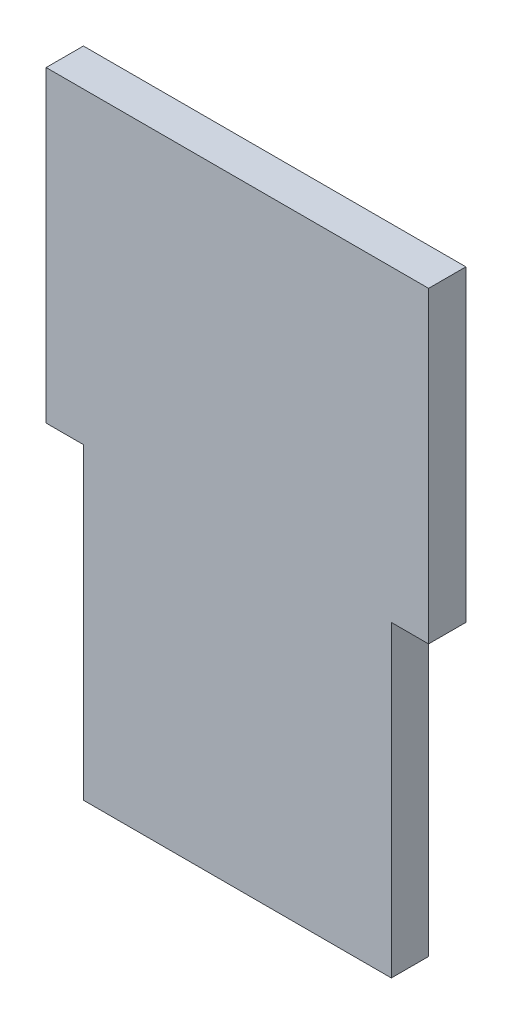
ISO-10303-21;
HEADER;
FILE_DESCRIPTION(('STEP AP214'),'2;1');
FILE_NAME('part.step','',(''),(''),'','','');
FILE_SCHEMA(('AUTOMOTIVE_DESIGN { 1 0 10303 214 1 1 1 1 }'));
ENDSEC;
DATA;
#1=APPLICATION_CONTEXT('core data for automotive mechanical design processes');
#2=APPLICATION_PROTOCOL_DEFINITION('international standard','automotive_design',2000,#1);
#3=PRODUCT_CONTEXT('',#1,'mechanical');
#4=PRODUCT('Part','Part','',(#3));
#5=PRODUCT_RELATED_PRODUCT_CATEGORY('part','',(#4));
#6=PRODUCT_DEFINITION_FORMATION('','',#4);
#7=PRODUCT_DEFINITION_CONTEXT('part definition',#1,'design');
#8=PRODUCT_DEFINITION('design','',#6,#7);
#9=PRODUCT_DEFINITION_SHAPE('','',#8);
#10=(LENGTH_UNIT() NAMED_UNIT(*) SI_UNIT(.MILLI.,.METRE.));
#11=(NAMED_UNIT(*) PLANE_ANGLE_UNIT() SI_UNIT($,.RADIAN.));
#12=(NAMED_UNIT(*) SI_UNIT($,.STERADIAN.) SOLID_ANGLE_UNIT());
#13=UNCERTAINTY_MEASURE_WITH_UNIT(LENGTH_MEASURE(1.E-05),#10,'distance_accuracy_value','');
#14=(GEOMETRIC_REPRESENTATION_CONTEXT(3) GLOBAL_UNCERTAINTY_ASSIGNED_CONTEXT((#13)) GLOBAL_UNIT_ASSIGNED_CONTEXT((#10,
#11,#12)) REPRESENTATION_CONTEXT('',''));
#15=CARTESIAN_POINT('',(0.,0.,0.));
#16=DIRECTION('',(0.,0.,1.));
#17=DIRECTION('',(1.,0.,0.));
#18=AXIS2_PLACEMENT_3D('',#15,#16,#17);
#19=CARTESIAN_POINT('',(-3.07339999999999,0.,3.0734));
#20=DIRECTION('',(1.,0.,0.));
#21=DIRECTION('',(0.,1.,0.));
#22=AXIS2_PLACEMENT_3D('',#19,#20,#21);
#23=PLANE('',#22);
#24=DIRECTION('',(0.,-1.,0.));
#25=VECTOR('',#24,1.);
#26=CARTESIAN_POINT('',(-3.07339999999999,0.,0.));
#27=LINE('',#26,#25);
#28=CARTESIAN_POINT('',(-3.0734,50.8,0.));
#29=VERTEX_POINT('',#28);
#30=CARTESIAN_POINT('',(-3.0734,25.4,0.));
#31=VERTEX_POINT('',#30);
#32=EDGE_CURVE('E127',#29,#31,#27,.T.);
#33=ORIENTED_EDGE('',*,*,#32,.T.);
#34=DIRECTION('',(0.,0.,-1.));
#35=VECTOR('',#34,1.);
#36=CARTESIAN_POINT('',(-3.0734,25.4,3.0734));
#37=LINE('',#36,#35);
#38=CARTESIAN_POINT('',(-3.0734,25.4,3.0734));
#39=VERTEX_POINT('',#38);
#40=EDGE_CURVE('E11',#39,#31,#37,.T.);
#41=ORIENTED_EDGE('',*,*,#40,.F.);
#42=DIRECTION('',(0.,-1.,0.));
#43=VECTOR('',#42,1.);
#44=CARTESIAN_POINT('',(-3.07339999999999,0.,3.0734));
#45=LINE('',#44,#43);
#46=CARTESIAN_POINT('',(-3.0734,50.8,3.0734));
#47=VERTEX_POINT('',#46);
#48=EDGE_CURVE('E145',#47,#39,#45,.T.);
#49=ORIENTED_EDGE('',*,*,#48,.F.);
#50=DIRECTION('',(0.,0.,-1.));
#51=VECTOR('',#50,1.);
#52=CARTESIAN_POINT('',(-3.0734,50.8,3.0734));
#53=LINE('',#52,#51);
#54=EDGE_CURVE('E123',#47,#29,#53,.T.);
#55=ORIENTED_EDGE('',*,*,#54,.T.);
#56=EDGE_LOOP('',(#33,#41,#49,#55));
#57=FACE_BOUND('',#56,.T.);
#58=ADVANCED_FACE('F33',(#57),#23,.F.);
#59=CARTESIAN_POINT('',(0.,25.4,3.0734));
#60=DIRECTION('',(0.,1.,0.));
#61=DIRECTION('',(0.,0.,1.));
#62=AXIS2_PLACEMENT_3D('',#59,#60,#61);
#63=PLANE('',#62);
#64=DIRECTION('',(1.,0.,0.));
#65=VECTOR('',#64,1.);
#66=CARTESIAN_POINT('',(0.,25.4,0.));
#67=LINE('',#66,#65);
#68=CARTESIAN_POINT('',(0.,25.4,0.));
#69=VERTEX_POINT('',#68);
#70=EDGE_CURVE('E130',#31,#69,#67,.T.);
#71=ORIENTED_EDGE('',*,*,#70,.T.);
#72=DIRECTION('',(0.,0.,-1.));
#73=VECTOR('',#72,1.);
#74=CARTESIAN_POINT('',(0.,25.4,3.0734));
#75=LINE('',#74,#73);
#76=CARTESIAN_POINT('',(0.,25.4,3.0734));
#77=VERTEX_POINT('',#76);
#78=EDGE_CURVE('E41',#77,#69,#75,.T.);
#79=ORIENTED_EDGE('',*,*,#78,.F.);
#80=DIRECTION('',(1.,0.,0.));
#81=VECTOR('',#80,1.);
#82=CARTESIAN_POINT('',(0.,25.4,3.0734));
#83=LINE('',#82,#81);
#84=EDGE_CURVE('E88',#39,#77,#83,.T.);
#85=ORIENTED_EDGE('',*,*,#84,.F.);
#86=ORIENTED_EDGE('',*,*,#40,.T.);
#87=EDGE_LOOP('',(#71,#79,#85,#86));
#88=FACE_BOUND('',#87,.T.);
#89=ADVANCED_FACE('F159',(#88),#63,.F.);
#90=CARTESIAN_POINT('',(0.,0.,3.0734));
#91=DIRECTION('',(-1.,0.,0.));
#92=DIRECTION('',(0.,0.,1.));
#93=AXIS2_PLACEMENT_3D('',#90,#91,#92);
#94=PLANE('',#93);
#95=DIRECTION('',(0.,1.,0.));
#96=VECTOR('',#95,1.);
#97=CARTESIAN_POINT('',(0.,0.,0.));
#98=LINE('',#97,#96);
#99=CARTESIAN_POINT('',(0.,0.,0.));
#100=VERTEX_POINT('',#99);
#101=EDGE_CURVE('E133',#100,#69,#98,.T.);
#102=ORIENTED_EDGE('',*,*,#101,.F.);
#103=DIRECTION('',(0.,0.,-1.));
#104=VECTOR('',#103,1.);
#105=CARTESIAN_POINT('',(0.,0.,3.0734));
#106=LINE('',#105,#104);
#107=CARTESIAN_POINT('',(0.,0.,3.0734));
#108=VERTEX_POINT('',#107);
#109=EDGE_CURVE('E152',#108,#100,#106,.T.);
#110=ORIENTED_EDGE('',*,*,#109,.F.);
#111=DIRECTION('',(0.,1.,0.));
#112=VECTOR('',#111,1.);
#113=CARTESIAN_POINT('',(0.,0.,3.0734));
#114=LINE('',#113,#112);
#115=EDGE_CURVE('E158',#108,#77,#114,.T.);
#116=ORIENTED_EDGE('',*,*,#115,.T.);
#117=ORIENTED_EDGE('',*,*,#78,.T.);
#118=EDGE_LOOP('',(#102,#110,#116,#117));
#119=FACE_BOUND('',#118,.T.);
#120=ADVANCED_FACE('F156',(#119),#94,.T.);
#121=CARTESIAN_POINT('',(0.,0.,3.0734));
#122=DIRECTION('',(0.,1.,0.));
#123=DIRECTION('',(0.,0.,1.));
#124=AXIS2_PLACEMENT_3D('',#121,#122,#123);
#125=PLANE('',#124);
#126=DIRECTION('',(1.,0.,0.));
#127=VECTOR('',#126,1.);
#128=CARTESIAN_POINT('',(0.,0.,0.));
#129=LINE('',#128,#127);
#130=CARTESIAN_POINT('',(25.4,0.,0.));
#131=VERTEX_POINT('',#130);
#132=EDGE_CURVE('E136',#100,#131,#129,.T.);
#133=ORIENTED_EDGE('',*,*,#132,.T.);
#134=DIRECTION('',(0.,0.,-1.));
#135=VECTOR('',#134,1.);
#136=CARTESIAN_POINT('',(25.4,0.,3.0734));
#137=LINE('',#136,#135);
#138=CARTESIAN_POINT('',(25.4,0.,3.0734));
#139=VERTEX_POINT('',#138);
#140=EDGE_CURVE('E149',#139,#131,#137,.T.);
#141=ORIENTED_EDGE('',*,*,#140,.F.);
#142=DIRECTION('',(1.,0.,0.));
#143=VECTOR('',#142,1.);
#144=CARTESIAN_POINT('',(0.,0.,3.0734));
#145=LINE('',#144,#143);
#146=EDGE_CURVE('E172',#108,#139,#145,.T.);
#147=ORIENTED_EDGE('',*,*,#146,.F.);
#148=ORIENTED_EDGE('',*,*,#109,.T.);
#149=EDGE_LOOP('',(#133,#141,#147,#148));
#150=FACE_BOUND('',#149,.T.);
#151=ADVANCED_FACE('F168',(#150),#125,.F.);
#152=CARTESIAN_POINT('',(25.4,0.,3.0734));
#153=DIRECTION('',(-1.,0.,0.));
#154=DIRECTION('',(0.,-1.,0.));
#155=AXIS2_PLACEMENT_3D('',#152,#153,#154);
#156=PLANE('',#155);
#157=DIRECTION('',(0.,1.,0.));
#158=VECTOR('',#157,1.);
#159=CARTESIAN_POINT('',(25.4,0.,0.));
#160=LINE('',#159,#158);
#161=CARTESIAN_POINT('',(25.4,25.4,0.));
#162=VERTEX_POINT('',#161);
#163=EDGE_CURVE('E138',#131,#162,#160,.T.);
#164=ORIENTED_EDGE('',*,*,#163,.T.);
#165=DIRECTION('',(0.,0.,-1.));
#166=VECTOR('',#165,1.);
#167=CARTESIAN_POINT('',(25.4,25.4,3.0734));
#168=LINE('',#167,#166);
#169=CARTESIAN_POINT('',(25.4,25.4,3.0734));
#170=VERTEX_POINT('',#169);
#171=EDGE_CURVE('E113',#170,#162,#168,.T.);
#172=ORIENTED_EDGE('',*,*,#171,.F.);
#173=DIRECTION('',(0.,1.,0.));
#174=VECTOR('',#173,1.);
#175=CARTESIAN_POINT('',(25.4,0.,3.0734));
#176=LINE('',#175,#174);
#177=EDGE_CURVE('E118',#139,#170,#176,.T.);
#178=ORIENTED_EDGE('',*,*,#177,.F.);
#179=ORIENTED_EDGE('',*,*,#140,.T.);
#180=EDGE_LOOP('',(#164,#172,#178,#179));
#181=FACE_BOUND('',#180,.T.);
#182=ADVANCED_FACE('F171',(#181),#156,.F.);
#183=CARTESIAN_POINT('',(0.,25.4,3.0734));
#184=DIRECTION('',(0.,-1.,0.));
#185=DIRECTION('',(0.,0.,-1.));
#186=AXIS2_PLACEMENT_3D('',#183,#184,#185);
#187=PLANE('',#186);
#188=DIRECTION('',(-1.,0.,0.));
#189=VECTOR('',#188,1.);
#190=CARTESIAN_POINT('',(0.,25.4,0.));
#191=LINE('',#190,#189);
#192=CARTESIAN_POINT('',(28.4734,25.4,0.));
#193=VERTEX_POINT('',#192);
#194=EDGE_CURVE('E108',#193,#162,#191,.T.);
#195=ORIENTED_EDGE('',*,*,#194,.F.);
#196=DIRECTION('',(0.,0.,-1.));
#197=VECTOR('',#196,1.);
#198=CARTESIAN_POINT('',(28.4734,25.4,3.0734));
#199=LINE('',#198,#197);
#200=CARTESIAN_POINT('',(28.4734,25.4,3.0734));
#201=VERTEX_POINT('',#200);
#202=EDGE_CURVE('E103',#201,#193,#199,.T.);
#203=ORIENTED_EDGE('',*,*,#202,.F.);
#204=DIRECTION('',(-1.,0.,0.));
#205=VECTOR('',#204,1.);
#206=CARTESIAN_POINT('',(0.,25.4,3.0734));
#207=LINE('',#206,#205);
#208=EDGE_CURVE('E106',#201,#170,#207,.T.);
#209=ORIENTED_EDGE('',*,*,#208,.T.);
#210=ORIENTED_EDGE('',*,*,#171,.T.);
#211=EDGE_LOOP('',(#195,#203,#209,#210));
#212=FACE_BOUND('',#211,.T.);
#213=ADVANCED_FACE('F105',(#212),#187,.T.);
#214=CARTESIAN_POINT('',(28.4734,0.,3.0734));
#215=DIRECTION('',(1.,0.,0.));
#216=DIRECTION('',(0.,1.,0.));
#217=AXIS2_PLACEMENT_3D('',#214,#215,#216);
#218=PLANE('',#217);
#219=DIRECTION('',(0.,-1.,0.));
#220=VECTOR('',#219,1.);
#221=CARTESIAN_POINT('',(28.4734,0.,0.));
#222=LINE('',#221,#220);
#223=CARTESIAN_POINT('',(28.4734,50.8,0.));
#224=VERTEX_POINT('',#223);
#225=EDGE_CURVE('E142',#224,#193,#222,.T.);
#226=ORIENTED_EDGE('',*,*,#225,.F.);
#227=DIRECTION('',(0.,0.,-1.));
#228=VECTOR('',#227,1.);
#229=CARTESIAN_POINT('',(28.4734,50.8,3.0734));
#230=LINE('',#229,#228);
#231=CARTESIAN_POINT('',(28.4734,50.8,3.0734));
#232=VERTEX_POINT('',#231);
#233=EDGE_CURVE('E77',#232,#224,#230,.T.);
#234=ORIENTED_EDGE('',*,*,#233,.F.);
#235=DIRECTION('',(0.,-1.,0.));
#236=VECTOR('',#235,1.);
#237=CARTESIAN_POINT('',(28.4734,0.,3.0734));
#238=LINE('',#237,#236);
#239=EDGE_CURVE('E116',#232,#201,#238,.T.);
#240=ORIENTED_EDGE('',*,*,#239,.T.);
#241=ORIENTED_EDGE('',*,*,#202,.T.);
#242=EDGE_LOOP('',(#226,#234,#240,#241));
#243=FACE_BOUND('',#242,.T.);
#244=ADVANCED_FACE('F121',(#243),#218,.T.);
#245=CARTESIAN_POINT('',(0.,50.8,3.0734));
#246=DIRECTION('',(0.,-1.,0.));
#247=DIRECTION('',(0.,0.,-1.));
#248=AXIS2_PLACEMENT_3D('',#245,#246,#247);
#249=PLANE('',#248);
#250=DIRECTION('',(-1.,0.,0.));
#251=VECTOR('',#250,1.);
#252=CARTESIAN_POINT('',(0.,50.8,0.));
#253=LINE('',#252,#251);
#254=EDGE_CURVE('E80',#224,#29,#253,.T.);
#255=ORIENTED_EDGE('',*,*,#254,.T.);
#256=ORIENTED_EDGE('',*,*,#54,.F.);
#257=DIRECTION('',(-1.,0.,0.));
#258=VECTOR('',#257,1.);
#259=CARTESIAN_POINT('',(0.,50.8,3.0734));
#260=LINE('',#259,#258);
#261=EDGE_CURVE('E49',#232,#47,#260,.T.);
#262=ORIENTED_EDGE('',*,*,#261,.F.);
#263=ORIENTED_EDGE('',*,*,#233,.T.);
#264=EDGE_LOOP('',(#255,#256,#262,#263));
#265=FACE_BOUND('',#264,.T.);
#266=ADVANCED_FACE('F179',(#265),#249,.F.);
#267=CARTESIAN_POINT('',(0.,0.,3.0734));
#268=DIRECTION('',(0.,0.,1.));
#269=DIRECTION('',(1.,0.,0.));
#270=AXIS2_PLACEMENT_3D('',#267,#268,#269);
#271=PLANE('',#270);
#272=ORIENTED_EDGE('',*,*,#48,.T.);
#273=ORIENTED_EDGE('',*,*,#84,.T.);
#274=ORIENTED_EDGE('',*,*,#115,.F.);
#275=ORIENTED_EDGE('',*,*,#146,.T.);
#276=ORIENTED_EDGE('',*,*,#177,.T.);
#277=ORIENTED_EDGE('',*,*,#208,.F.);
#278=ORIENTED_EDGE('',*,*,#239,.F.);
#279=ORIENTED_EDGE('',*,*,#261,.T.);
#280=EDGE_LOOP('',(#272,#273,#274,#275,#276,#277,#278,#279));
#281=FACE_BOUND('',#280,.T.);
#282=ADVANCED_FACE('F115',(#281),#271,.T.);
#283=CARTESIAN_POINT('',(0.,0.,0.));
#284=DIRECTION('',(0.,0.,1.));
#285=DIRECTION('',(1.,0.,0.));
#286=AXIS2_PLACEMENT_3D('',#283,#284,#285);
#287=PLANE('',#286);
#288=ORIENTED_EDGE('',*,*,#32,.F.);
#289=ORIENTED_EDGE('',*,*,#254,.F.);
#290=ORIENTED_EDGE('',*,*,#225,.T.);
#291=ORIENTED_EDGE('',*,*,#194,.T.);
#292=ORIENTED_EDGE('',*,*,#163,.F.);
#293=ORIENTED_EDGE('',*,*,#132,.F.);
#294=ORIENTED_EDGE('',*,*,#101,.T.);
#295=ORIENTED_EDGE('',*,*,#70,.F.);
#296=EDGE_LOOP('',(#288,#289,#290,#291,#292,#293,#294,#295));
#297=FACE_BOUND('',#296,.T.);
#298=ADVANCED_FACE('F164',(#297),#287,.F.);
#299=CLOSED_SHELL('',(#58,#89,#120,#151,#182,#213,#244,#266,#282,#298));
#300=MANIFOLD_SOLID_BREP('B2',#299);
#301=ADVANCED_BREP_SHAPE_REPRESENTATION('',(#18,#300),#14);
#302=SHAPE_DEFINITION_REPRESENTATION(#9,#301);
ENDSEC;
END-ISO-10303-21;
